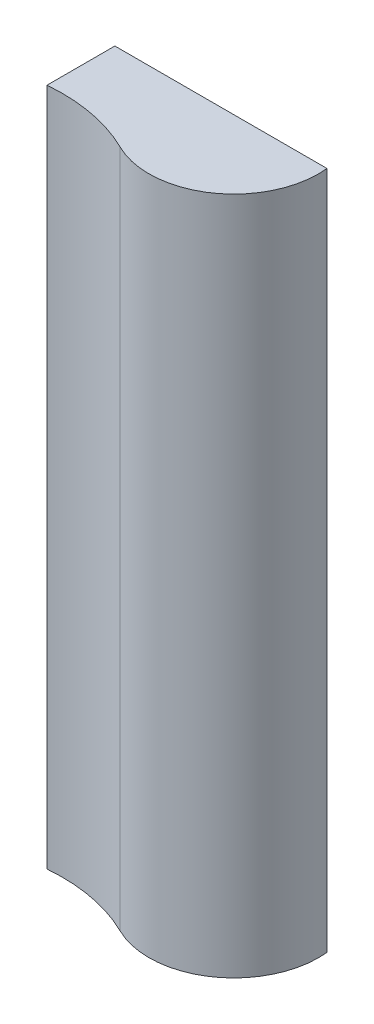
ISO-10303-21;
HEADER;
FILE_DESCRIPTION(('STEP AP214'),'2;1');
FILE_NAME('part.step','',(''),(''),'','','');
FILE_SCHEMA(('AUTOMOTIVE_DESIGN { 1 0 10303 214 1 1 1 1 }'));
ENDSEC;
DATA;
#1=APPLICATION_CONTEXT('core data for automotive mechanical design processes');
#2=APPLICATION_PROTOCOL_DEFINITION('international standard','automotive_design',2000,#1);
#3=PRODUCT_CONTEXT('',#1,'mechanical');
#4=PRODUCT('Part','Part','',(#3));
#5=PRODUCT_RELATED_PRODUCT_CATEGORY('part','',(#4));
#6=PRODUCT_DEFINITION_FORMATION('','',#4);
#7=PRODUCT_DEFINITION_CONTEXT('part definition',#1,'design');
#8=PRODUCT_DEFINITION('design','',#6,#7);
#9=PRODUCT_DEFINITION_SHAPE('','',#8);
#10=(LENGTH_UNIT() NAMED_UNIT(*) SI_UNIT(.MILLI.,.METRE.));
#11=(NAMED_UNIT(*) PLANE_ANGLE_UNIT() SI_UNIT($,.RADIAN.));
#12=(NAMED_UNIT(*) SI_UNIT($,.STERADIAN.) SOLID_ANGLE_UNIT());
#13=UNCERTAINTY_MEASURE_WITH_UNIT(LENGTH_MEASURE(1.E-05),#10,'distance_accuracy_value','');
#14=(GEOMETRIC_REPRESENTATION_CONTEXT(3) GLOBAL_UNCERTAINTY_ASSIGNED_CONTEXT((#13)) GLOBAL_UNIT_ASSIGNED_CONTEXT((#10,
#11,#12)) REPRESENTATION_CONTEXT('',''));
#15=CARTESIAN_POINT('',(0.,0.,0.));
#16=DIRECTION('',(0.,0.,1.));
#17=DIRECTION('',(1.,0.,0.));
#18=AXIS2_PLACEMENT_3D('',#15,#16,#17);
#19=CARTESIAN_POINT('',(-0.537801442027,-2.,1.396190951318));
#20=DIRECTION('',(0.,-1.,0.));
#21=DIRECTION('',(0.,0.,-1.));
#22=AXIS2_PLACEMENT_3D('',#19,#20,#21);
#23=CYLINDRICAL_SURFACE('',#22,1.);
#24=DIRECTION('',(0.,1.,0.));
#25=VECTOR('',#24,1.);
#26=CARTESIAN_POINT('',(-0.625,-2.,0.4));
#27=LINE('',#26,#25);
#28=CARTESIAN_POINT('',(-0.625,2.,0.400000000000108));
#29=VERTEX_POINT('',#28);
#30=CARTESIAN_POINT('',(-0.625,-2.,0.400000000000108));
#31=VERTEX_POINT('',#30);
#32=EDGE_CURVE('E82',#29,#31,#27,.F.);
#33=ORIENTED_EDGE('',*,*,#32,.T.);
#34=CARTESIAN_POINT('',(-0.537801442027,-2.,1.396190951318));
#35=DIRECTION('',(0.,-1.,0.));
#36=DIRECTION('',(0.,0.,-1.));
#37=AXIS2_PLACEMENT_3D('',#34,#35,#36);
#38=CIRCLE('',#37,1.);
#39=CARTESIAN_POINT('',(-0.0941328959522892,-2.,0.500000000000109));
#40=VERTEX_POINT('',#39);
#41=EDGE_CURVE('E79',#31,#40,#38,.T.);
#42=ORIENTED_EDGE('',*,*,#41,.T.);
#43=DIRECTION('',(0.,-1.,0.));
#44=VECTOR('',#43,1.);
#45=CARTESIAN_POINT('',(-0.0941328959522117,-2.,0.500000000000085));
#46=LINE('',#45,#44);
#47=CARTESIAN_POINT('',(-0.0941328959522892,2.,0.500000000000109));
#48=VERTEX_POINT('',#47);
#49=EDGE_CURVE('E107',#48,#40,#46,.T.);
#50=ORIENTED_EDGE('',*,*,#49,.F.);
#51=CARTESIAN_POINT('',(-0.537801442027,2.,1.396190951318));
#52=DIRECTION('',(0.,-1.,0.));
#53=DIRECTION('',(0.,0.,-1.));
#54=AXIS2_PLACEMENT_3D('',#51,#52,#53);
#55=CIRCLE('',#54,1.);
#56=EDGE_CURVE('E20',#29,#48,#55,.T.);
#57=ORIENTED_EDGE('',*,*,#56,.F.);
#58=EDGE_LOOP('',(#33,#42,#50,#57));
#59=FACE_BOUND('',#58,.T.);
#60=ADVANCED_FACE('F17',(#59),#23,.F.);
#61=CARTESIAN_POINT('',(-0.625,-2.,0.4));
#62=DIRECTION('',(1.,0.,0.));
#63=DIRECTION('',(0.,0.,-1.));
#64=AXIS2_PLACEMENT_3D('',#61,#62,#63);
#65=PLANE('',#64);
#66=DIRECTION('',(0.,1.,0.));
#67=VECTOR('',#66,1.);
#68=CARTESIAN_POINT('',(-0.625,-2.,0.));
#69=LINE('',#68,#67);
#70=CARTESIAN_POINT('',(-0.625,2.,0.));
#71=VERTEX_POINT('',#70);
#72=CARTESIAN_POINT('',(-0.625,-2.,0.));
#73=VERTEX_POINT('',#72);
#74=EDGE_CURVE('E66',#71,#73,#69,.F.);
#75=ORIENTED_EDGE('',*,*,#74,.T.);
#76=DIRECTION('',(0.,0.,1.));
#77=VECTOR('',#76,1.);
#78=CARTESIAN_POINT('',(-0.625,-2.,1.396190951318));
#79=LINE('',#78,#77);
#80=EDGE_CURVE('E74',#73,#31,#79,.T.);
#81=ORIENTED_EDGE('',*,*,#80,.T.);
#82=ORIENTED_EDGE('',*,*,#32,.F.);
#83=DIRECTION('',(0.,0.,1.));
#84=VECTOR('',#83,1.);
#85=CARTESIAN_POINT('',(-0.625,2.,1.396190951318));
#86=LINE('',#85,#84);
#87=EDGE_CURVE('E90',#71,#29,#86,.T.);
#88=ORIENTED_EDGE('',*,*,#87,.F.);
#89=EDGE_LOOP('',(#75,#81,#82,#88));
#90=FACE_BOUND('',#89,.T.);
#91=ADVANCED_FACE('F89',(#90),#65,.F.);
#92=CARTESIAN_POINT('',(-0.537801442027,-2.,1.396190951318));
#93=DIRECTION('',(0.,1.,0.));
#94=DIRECTION('',(0.,0.,1.));
#95=AXIS2_PLACEMENT_3D('',#92,#93,#94);
#96=PLANE('',#95);
#97=ORIENTED_EDGE('',*,*,#80,.F.);
#98=DIRECTION('',(1.,0.,0.));
#99=VECTOR('',#98,1.);
#100=CARTESIAN_POINT('',(-0.625,-2.,0.));
#101=LINE('',#100,#99);
#102=CARTESIAN_POINT('',(0.624999999999884,-2.,0.));
#103=VERTEX_POINT('',#102);
#104=EDGE_CURVE('E77',#73,#103,#101,.T.);
#105=ORIENTED_EDGE('',*,*,#104,.T.);
#106=CARTESIAN_POINT('',(0.127701377085,-2.,0.0519045243411));
#107=DIRECTION('',(0.,-1.,0.));
#108=DIRECTION('',(0.,0.,-1.));
#109=AXIS2_PLACEMENT_3D('',#106,#107,#108);
#110=CIRCLE('',#109,0.5);
#111=EDGE_CURVE('E110',#40,#103,#110,.F.);
#112=ORIENTED_EDGE('',*,*,#111,.F.);
#113=ORIENTED_EDGE('',*,*,#41,.F.);
#114=EDGE_LOOP('',(#97,#105,#112,#113));
#115=FACE_BOUND('',#114,.T.);
#116=ADVANCED_FACE('F75',(#115),#96,.F.);
#117=CARTESIAN_POINT('',(0.127701377085,-2.,0.0519045243411));
#118=DIRECTION('',(0.,-1.,0.));
#119=DIRECTION('',(0.,0.,-1.));
#120=AXIS2_PLACEMENT_3D('',#117,#118,#119);
#121=CYLINDRICAL_SURFACE('',#120,0.5);
#122=ORIENTED_EDGE('',*,*,#111,.T.);
#123=DIRECTION('',(0.,1.,0.));
#124=VECTOR('',#123,1.);
#125=CARTESIAN_POINT('',(0.625,-2.,0.));
#126=LINE('',#125,#124);
#127=CARTESIAN_POINT('',(0.624999999999884,2.,0.));
#128=VERTEX_POINT('',#127);
#129=EDGE_CURVE('E27',#103,#128,#126,.T.);
#130=ORIENTED_EDGE('',*,*,#129,.T.);
#131=CARTESIAN_POINT('',(0.127701377085,2.,0.0519045243411));
#132=DIRECTION('',(0.,-1.,0.));
#133=DIRECTION('',(0.,0.,-1.));
#134=AXIS2_PLACEMENT_3D('',#131,#132,#133);
#135=CIRCLE('',#134,0.5);
#136=EDGE_CURVE('E38',#48,#128,#135,.F.);
#137=ORIENTED_EDGE('',*,*,#136,.F.);
#138=ORIENTED_EDGE('',*,*,#49,.T.);
#139=EDGE_LOOP('',(#122,#130,#137,#138));
#140=FACE_BOUND('',#139,.T.);
#141=ADVANCED_FACE('F117',(#140),#121,.T.);
#142=CARTESIAN_POINT('',(-0.537801442027,2.,1.396190951318));
#143=DIRECTION('',(0.,1.,0.));
#144=DIRECTION('',(0.,0.,1.));
#145=AXIS2_PLACEMENT_3D('',#142,#143,#144);
#146=PLANE('',#145);
#147=DIRECTION('',(1.,0.,0.));
#148=VECTOR('',#147,1.);
#149=CARTESIAN_POINT('',(-0.625,2.,0.));
#150=LINE('',#149,#148);
#151=EDGE_CURVE('E11',#128,#71,#150,.F.);
#152=ORIENTED_EDGE('',*,*,#151,.T.);
#153=ORIENTED_EDGE('',*,*,#87,.T.);
#154=ORIENTED_EDGE('',*,*,#56,.T.);
#155=ORIENTED_EDGE('',*,*,#136,.T.);
#156=EDGE_LOOP('',(#152,#153,#154,#155));
#157=FACE_BOUND('',#156,.T.);
#158=ADVANCED_FACE('F125',(#157),#146,.T.);
#159=CARTESIAN_POINT('',(-0.625,-2.,0.));
#160=DIRECTION('',(0.,0.,1.));
#161=DIRECTION('',(1.,0.,0.));
#162=AXIS2_PLACEMENT_3D('',#159,#160,#161);
#163=PLANE('',#162);
#164=ORIENTED_EDGE('',*,*,#129,.F.);
#165=ORIENTED_EDGE('',*,*,#104,.F.);
#166=ORIENTED_EDGE('',*,*,#74,.F.);
#167=ORIENTED_EDGE('',*,*,#151,.F.);
#168=EDGE_LOOP('',(#164,#165,#166,#167));
#169=FACE_BOUND('',#168,.T.);
#170=ADVANCED_FACE('F85',(#169),#163,.F.);
#171=CLOSED_SHELL('',(#60,#91,#116,#141,#158,#170));
#172=MANIFOLD_SOLID_BREP('B1',#171);
#173=ADVANCED_BREP_SHAPE_REPRESENTATION('',(#18,#172),#14);
#174=SHAPE_DEFINITION_REPRESENTATION(#9,#173);
ENDSEC;
END-ISO-10303-21;
